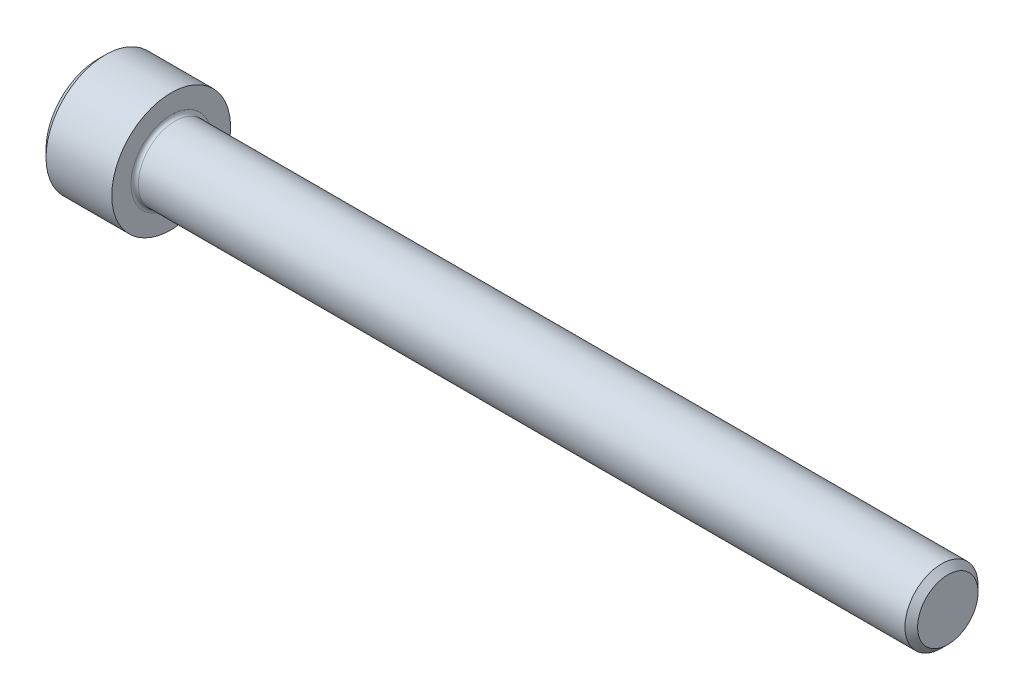
ISO-10303-21;
HEADER;
FILE_DESCRIPTION(('STEP AP214'),'2;1');
FILE_NAME('part.step','',(''),(''),'','','');
FILE_SCHEMA(('AUTOMOTIVE_DESIGN { 1 0 10303 214 1 1 1 1 }'));
ENDSEC;
DATA;
#1=APPLICATION_CONTEXT('core data for automotive mechanical design processes');
#2=APPLICATION_PROTOCOL_DEFINITION('international standard','automotive_design',2000,#1);
#3=PRODUCT_CONTEXT('',#1,'mechanical');
#4=PRODUCT('Part','Part','',(#3));
#5=PRODUCT_RELATED_PRODUCT_CATEGORY('part','',(#4));
#6=PRODUCT_DEFINITION_FORMATION('','',#4);
#7=PRODUCT_DEFINITION_CONTEXT('part definition',#1,'design');
#8=PRODUCT_DEFINITION('design','',#6,#7);
#9=PRODUCT_DEFINITION_SHAPE('','',#8);
#10=(LENGTH_UNIT() NAMED_UNIT(*) SI_UNIT(.MILLI.,.METRE.));
#11=(NAMED_UNIT(*) PLANE_ANGLE_UNIT() SI_UNIT($,.RADIAN.));
#12=(NAMED_UNIT(*) SI_UNIT($,.STERADIAN.) SOLID_ANGLE_UNIT());
#13=UNCERTAINTY_MEASURE_WITH_UNIT(LENGTH_MEASURE(1.E-05),#10,'distance_accuracy_value','');
#14=(GEOMETRIC_REPRESENTATION_CONTEXT(3) GLOBAL_UNCERTAINTY_ASSIGNED_CONTEXT((#13)) GLOBAL_UNIT_ASSIGNED_CONTEXT((#10,
#11,#12)) REPRESENTATION_CONTEXT('',''));
#15=CARTESIAN_POINT('',(0.,0.,0.));
#16=DIRECTION('',(0.,0.,1.));
#17=DIRECTION('',(1.,0.,0.));
#18=AXIS2_PLACEMENT_3D('',#15,#16,#17);
#19=CARTESIAN_POINT('',(0.,0.,0.));
#20=DIRECTION('',(-1.,0.,0.));
#21=DIRECTION('',(0.,0.,1.));
#22=AXIS2_PLACEMENT_3D('',#19,#20,#21);
#23=PLANE('',#22);
#24=DIRECTION('',(0.,-0.5,0.866025403784438));
#25=VECTOR('',#24,1.);
#26=CARTESIAN_POINT('',(0.,3.51894989071077,0.));
#27=LINE('',#26,#25);
#28=CARTESIAN_POINT('',(0.,3.51894989071077,0.));
#29=VERTEX_POINT('',#28);
#30=CARTESIAN_POINT('',(0.,1.75947494535538,3.04749999999999));
#31=VERTEX_POINT('',#30);
#32=EDGE_CURVE('E261',#29,#31,#27,.T.);
#33=ORIENTED_EDGE('',*,*,#32,.T.);
#34=DIRECTION('',(0.,1.,0.));
#35=VECTOR('',#34,1.);
#36=CARTESIAN_POINT('',(0.,-1.75947494535539,3.0475));
#37=LINE('',#36,#35);
#38=CARTESIAN_POINT('',(0.,-1.75947494535539,3.0475));
#39=VERTEX_POINT('',#38);
#40=EDGE_CURVE('E132',#39,#31,#37,.T.);
#41=ORIENTED_EDGE('',*,*,#40,.F.);
#42=DIRECTION('',(0.,-0.500000000000001,-0.866025403784438));
#43=VECTOR('',#42,1.);
#44=CARTESIAN_POINT('',(0.,-1.75947494535539,3.0475));
#45=LINE('',#44,#43);
#46=CARTESIAN_POINT('',(0.,-3.51894989071078,0.));
#47=VERTEX_POINT('',#46);
#48=EDGE_CURVE('E264',#39,#47,#45,.T.);
#49=ORIENTED_EDGE('',*,*,#48,.T.);
#50=DIRECTION('',(0.,0.5,-0.866025403784439));
#51=VECTOR('',#50,1.);
#52=CARTESIAN_POINT('',(0.,-3.51894989071078,0.));
#53=LINE('',#52,#51);
#54=CARTESIAN_POINT('',(0.,-1.75947494535539,-3.0475));
#55=VERTEX_POINT('',#54);
#56=EDGE_CURVE('E267',#47,#55,#53,.T.);
#57=ORIENTED_EDGE('',*,*,#56,.T.);
#58=DIRECTION('',(0.,-1.,0.));
#59=VECTOR('',#58,1.);
#60=CARTESIAN_POINT('',(0.,1.75947494535538,-3.04750000000001));
#61=LINE('',#60,#59);
#62=CARTESIAN_POINT('',(0.,1.75947494535538,-3.04750000000001));
#63=VERTEX_POINT('',#62);
#64=EDGE_CURVE('E270',#63,#55,#61,.T.);
#65=ORIENTED_EDGE('',*,*,#64,.F.);
#66=DIRECTION('',(0.,-0.500000000000001,-0.866025403784438));
#67=VECTOR('',#66,1.);
#68=CARTESIAN_POINT('',(0.,3.51894989071077,0.));
#69=LINE('',#68,#67);
#70=EDGE_CURVE('E127',#29,#63,#69,.T.);
#71=ORIENTED_EDGE('',*,*,#70,.F.);
#72=EDGE_LOOP('',(#33,#41,#49,#57,#65,#71));
#73=FACE_BOUND('',#72,.T.);
#74=CARTESIAN_POINT('',(0.,0.,0.));
#75=DIRECTION('',(-1.,0.,0.));
#76=DIRECTION('',(0.,0.,1.));
#77=AXIS2_PLACEMENT_3D('',#74,#75,#76);
#78=CIRCLE('',#77,5.7);
#79=CARTESIAN_POINT('',(0.,0.,5.7));
#80=VERTEX_POINT('',#79);
#81=EDGE_CURVE('E156',#80,#80,#78,.T.);
#82=ORIENTED_EDGE('',*,*,#81,.T.);
#83=EDGE_LOOP('',(#82));
#84=FACE_BOUND('',#83,.T.);
#85=ADVANCED_FACE('F36',(#73,#84),#23,.T.);
#86=CARTESIAN_POINT('',(0.,0.,0.));
#87=DIRECTION('',(1.,0.,0.));
#88=DIRECTION('',(0.,0.,-1.));
#89=AXIS2_PLACEMENT_3D('',#86,#87,#88);
#90=CONICAL_SURFACE('',#89,5.7,0.785398163397449);
#91=CARTESIAN_POINT('',(0.800000000000002,0.,0.));
#92=DIRECTION('',(-1.,0.,0.));
#93=DIRECTION('',(0.,0.,1.));
#94=AXIS2_PLACEMENT_3D('',#91,#92,#93);
#95=CIRCLE('',#94,6.5);
#96=CARTESIAN_POINT('',(0.800000000000002,0.,6.5));
#97=VERTEX_POINT('',#96);
#98=EDGE_CURVE('E153',#97,#97,#95,.T.);
#99=ORIENTED_EDGE('',*,*,#98,.T.);
#100=EDGE_LOOP('',(#99));
#101=FACE_BOUND('',#100,.T.);
#102=ORIENTED_EDGE('',*,*,#81,.F.);
#103=EDGE_LOOP('',(#102));
#104=FACE_BOUND('',#103,.T.);
#105=ADVANCED_FACE('F177',(#101,#104),#90,.T.);
#106=CARTESIAN_POINT('',(-31.75,0.,0.));
#107=DIRECTION('',(-1.,0.,0.));
#108=DIRECTION('',(0.,0.,1.));
#109=AXIS2_PLACEMENT_3D('',#106,#107,#108);
#110=CYLINDRICAL_SURFACE('',#109,6.5);
#111=CARTESIAN_POINT('',(8.,0.,0.));
#112=DIRECTION('',(-1.,0.,0.));
#113=DIRECTION('',(0.,0.,1.));
#114=AXIS2_PLACEMENT_3D('',#111,#112,#113);
#115=CIRCLE('',#114,6.5);
#116=CARTESIAN_POINT('',(8.,0.,6.5));
#117=VERTEX_POINT('',#116);
#118=EDGE_CURVE('E150',#117,#117,#115,.T.);
#119=ORIENTED_EDGE('',*,*,#118,.T.);
#120=EDGE_LOOP('',(#119));
#121=FACE_BOUND('',#120,.T.);
#122=ORIENTED_EDGE('',*,*,#98,.F.);
#123=EDGE_LOOP('',(#122));
#124=FACE_BOUND('',#123,.T.);
#125=ADVANCED_FACE('F182',(#121,#124),#110,.T.);
#126=CARTESIAN_POINT('',(8.,6.5,0.));
#127=DIRECTION('',(1.,0.,0.));
#128=DIRECTION('',(0.,0.,-1.));
#129=AXIS2_PLACEMENT_3D('',#126,#127,#128);
#130=PLANE('',#129);
#131=CARTESIAN_POINT('',(8.,0.,0.));
#132=DIRECTION('',(1.,0.,0.));
#133=DIRECTION('',(0.,0.,-1.));
#134=AXIS2_PLACEMENT_3D('',#131,#132,#133);
#135=CIRCLE('',#134,4.39999999999986);
#136=CARTESIAN_POINT('',(8.,0.,-4.39999999999986));
#137=VERTEX_POINT('',#136);
#138=EDGE_CURVE('E44',#137,#137,#135,.F.);
#139=ORIENTED_EDGE('',*,*,#138,.T.);
#140=EDGE_LOOP('',(#139));
#141=FACE_BOUND('',#140,.T.);
#142=ORIENTED_EDGE('',*,*,#118,.F.);
#143=EDGE_LOOP('',(#142));
#144=FACE_BOUND('',#143,.T.);
#145=ADVANCED_FACE('F161',(#141,#144),#130,.T.);
#146=CARTESIAN_POINT('',(-31.75,0.,0.));
#147=DIRECTION('',(-1.,0.,0.));
#148=DIRECTION('',(0.,0.,1.));
#149=AXIS2_PLACEMENT_3D('',#146,#147,#148);
#150=CYLINDRICAL_SURFACE('',#149,3.99999999999986);
#151=CARTESIAN_POINT('',(8.4,0.,0.));
#152=DIRECTION('',(1.,0.,0.));
#153=DIRECTION('',(0.,0.,-1.));
#154=AXIS2_PLACEMENT_3D('',#151,#152,#153);
#155=CIRCLE('',#154,3.99999999999986);
#156=CARTESIAN_POINT('',(8.4,0.,-3.99999999999986));
#157=VERTEX_POINT('',#156);
#158=EDGE_CURVE('E11',#157,#157,#155,.T.);
#159=ORIENTED_EDGE('',*,*,#158,.T.);
#160=EDGE_LOOP('',(#159));
#161=FACE_BOUND('',#160,.T.);
#162=CARTESIAN_POINT('',(92.3094999999997,0.,0.));
#163=DIRECTION('',(-1.,0.,0.));
#164=DIRECTION('',(0.,0.,1.));
#165=AXIS2_PLACEMENT_3D('',#162,#163,#164);
#166=CIRCLE('',#165,3.99999999999971);
#167=CARTESIAN_POINT('',(92.3094999999997,0.,3.99999999999971));
#168=VERTEX_POINT('',#167);
#169=EDGE_CURVE('E147',#168,#168,#166,.T.);
#170=ORIENTED_EDGE('',*,*,#169,.T.);
#171=EDGE_LOOP('',(#170));
#172=FACE_BOUND('',#171,.T.);
#173=ADVANCED_FACE('F192',(#161,#172),#150,.T.);
#174=CARTESIAN_POINT('',(93.,0.,0.));
#175=DIRECTION('',(-1.,0.,0.));
#176=DIRECTION('',(0.,0.,1.));
#177=AXIS2_PLACEMENT_3D('',#174,#175,#176);
#178=CONICAL_SURFACE('',#177,3.3095,0.785398163397043);
#179=ORIENTED_EDGE('',*,*,#169,.F.);
#180=EDGE_LOOP('',(#179));
#181=FACE_BOUND('',#180,.T.);
#182=CARTESIAN_POINT('',(93.,0.,0.));
#183=DIRECTION('',(-1.,0.,0.));
#184=DIRECTION('',(0.,0.,1.));
#185=AXIS2_PLACEMENT_3D('',#182,#183,#184);
#186=CIRCLE('',#185,3.3095);
#187=CARTESIAN_POINT('',(93.,0.,3.3095));
#188=VERTEX_POINT('',#187);
#189=EDGE_CURVE('E143',#188,#188,#186,.T.);
#190=ORIENTED_EDGE('',*,*,#189,.T.);
#191=EDGE_LOOP('',(#190));
#192=FACE_BOUND('',#191,.T.);
#193=ADVANCED_FACE('F172',(#181,#192),#178,.T.);
#194=CARTESIAN_POINT('',(93.,3.3095,0.));
#195=DIRECTION('',(1.,0.,0.));
#196=DIRECTION('',(0.,0.,-1.));
#197=AXIS2_PLACEMENT_3D('',#194,#195,#196);
#198=PLANE('',#197);
#199=ORIENTED_EDGE('',*,*,#189,.F.);
#200=EDGE_LOOP('',(#199));
#201=FACE_BOUND('',#200,.T.);
#202=ADVANCED_FACE('F165',(#201),#198,.T.);
#203=CARTESIAN_POINT('',(8.4,0.,0.));
#204=DIRECTION('',(1.,0.,0.));
#205=DIRECTION('',(0.,0.,-1.));
#206=AXIS2_PLACEMENT_3D('',#203,#204,#205);
#207=TOROIDAL_SURFACE('',#206,4.39999999999986,0.4);
#208=ORIENTED_EDGE('',*,*,#158,.F.);
#209=EDGE_LOOP('',(#208));
#210=FACE_BOUND('',#209,.T.);
#211=ORIENTED_EDGE('',*,*,#138,.F.);
#212=EDGE_LOOP('',(#211));
#213=FACE_BOUND('',#212,.T.);
#214=ADVANCED_FACE('F38',(#210,#213),#207,.F.);
#215=CARTESIAN_POINT('',(4.,3.51894989071077,0.));
#216=DIRECTION('',(0.,-0.866025403784438,-0.5));
#217=DIRECTION('',(0.,0.5,-0.866025403784438));
#218=AXIS2_PLACEMENT_3D('',#215,#216,#217);
#219=PLANE('',#218);
#220=ORIENTED_EDGE('',*,*,#32,.F.);
#221=DIRECTION('',(-1.,0.,0.));
#222=VECTOR('',#221,1.);
#223=CARTESIAN_POINT('',(4.,3.51894989071077,0.));
#224=LINE('',#223,#222);
#225=CARTESIAN_POINT('',(4.,3.51894989071077,0.));
#226=VERTEX_POINT('',#225);
#227=EDGE_CURVE('E251',#226,#29,#224,.T.);
#228=ORIENTED_EDGE('',*,*,#227,.F.);
#229=DIRECTION('',(0.,-0.5,0.866025403784438));
#230=VECTOR('',#229,1.);
#231=CARTESIAN_POINT('',(4.,3.51894989071077,0.));
#232=LINE('',#231,#230);
#233=CARTESIAN_POINT('',(4.,2.63921241803307,1.52375));
#234=VERTEX_POINT('',#233);
#235=EDGE_CURVE('E119',#226,#234,#232,.T.);
#236=ORIENTED_EDGE('',*,*,#235,.T.);
#237=CARTESIAN_POINT('',(4.,1.75947494535538,3.04749999999999));
#238=VERTEX_POINT('',#237);
#239=EDGE_CURVE('E110',#234,#238,#232,.T.);
#240=ORIENTED_EDGE('',*,*,#239,.T.);
#241=DIRECTION('',(-1.,0.,0.));
#242=VECTOR('',#241,1.);
#243=CARTESIAN_POINT('',(4.,1.75947494535538,3.04749999999999));
#244=LINE('',#243,#242);
#245=EDGE_CURVE('E124',#238,#31,#244,.T.);
#246=ORIENTED_EDGE('',*,*,#245,.T.);
#247=EDGE_LOOP('',(#220,#228,#236,#240,#246));
#248=FACE_BOUND('',#247,.T.);
#249=ADVANCED_FACE('F123',(#248),#219,.T.);
#250=CARTESIAN_POINT('',(4.,-1.75947494535539,3.0475));
#251=DIRECTION('',(0.,0.,1.));
#252=DIRECTION('',(0.,-1.,0.));
#253=AXIS2_PLACEMENT_3D('',#250,#251,#252);
#254=PLANE('',#253);
#255=ORIENTED_EDGE('',*,*,#40,.T.);
#256=ORIENTED_EDGE('',*,*,#245,.F.);
#257=DIRECTION('',(0.,1.,0.));
#258=VECTOR('',#257,1.);
#259=CARTESIAN_POINT('',(4.,-1.75947494535539,3.0475));
#260=LINE('',#259,#258);
#261=CARTESIAN_POINT('',(4.,0.,3.0475));
#262=VERTEX_POINT('',#261);
#263=EDGE_CURVE('E107',#262,#238,#260,.T.);
#264=ORIENTED_EDGE('',*,*,#263,.F.);
#265=CARTESIAN_POINT('',(4.,-1.75947494535539,3.0475));
#266=VERTEX_POINT('',#265);
#267=EDGE_CURVE('E118',#266,#262,#260,.T.);
#268=ORIENTED_EDGE('',*,*,#267,.F.);
#269=DIRECTION('',(-1.,0.,0.));
#270=VECTOR('',#269,1.);
#271=CARTESIAN_POINT('',(4.,-1.75947494535539,3.0475));
#272=LINE('',#271,#270);
#273=EDGE_CURVE('E134',#266,#39,#272,.T.);
#274=ORIENTED_EDGE('',*,*,#273,.T.);
#275=EDGE_LOOP('',(#255,#256,#264,#268,#274));
#276=FACE_BOUND('',#275,.T.);
#277=ADVANCED_FACE('F129',(#276),#254,.F.);
#278=CARTESIAN_POINT('',(4.,-1.75947494535539,3.0475));
#279=DIRECTION('',(0.,0.866025403784438,-0.500000000000001));
#280=DIRECTION('',(0.,0.500000000000001,0.866025403784438));
#281=AXIS2_PLACEMENT_3D('',#278,#279,#280);
#282=PLANE('',#281);
#283=ORIENTED_EDGE('',*,*,#48,.F.);
#284=ORIENTED_EDGE('',*,*,#273,.F.);
#285=DIRECTION('',(0.,-0.500000000000001,-0.866025403784438));
#286=VECTOR('',#285,1.);
#287=CARTESIAN_POINT('',(4.,-1.75947494535539,3.0475));
#288=LINE('',#287,#286);
#289=CARTESIAN_POINT('',(4.,-2.63921241803308,1.52375000000001));
#290=VERTEX_POINT('',#289);
#291=EDGE_CURVE('E290',#266,#290,#288,.T.);
#292=ORIENTED_EDGE('',*,*,#291,.T.);
#293=CARTESIAN_POINT('',(4.,-3.51894989071078,0.));
#294=VERTEX_POINT('',#293);
#295=EDGE_CURVE('E279',#290,#294,#288,.T.);
#296=ORIENTED_EDGE('',*,*,#295,.T.);
#297=DIRECTION('',(-1.,0.,0.));
#298=VECTOR('',#297,1.);
#299=CARTESIAN_POINT('',(4.,-3.51894989071078,0.));
#300=LINE('',#299,#298);
#301=EDGE_CURVE('E139',#294,#47,#300,.T.);
#302=ORIENTED_EDGE('',*,*,#301,.T.);
#303=EDGE_LOOP('',(#283,#284,#292,#296,#302));
#304=FACE_BOUND('',#303,.T.);
#305=ADVANCED_FACE('F205',(#304),#282,.T.);
#306=CARTESIAN_POINT('',(4.,-3.51894989071078,0.));
#307=DIRECTION('',(0.,0.866025403784439,0.5));
#308=DIRECTION('',(0.,-0.5,0.866025403784439));
#309=AXIS2_PLACEMENT_3D('',#306,#307,#308);
#310=PLANE('',#309);
#311=ORIENTED_EDGE('',*,*,#56,.F.);
#312=ORIENTED_EDGE('',*,*,#301,.F.);
#313=DIRECTION('',(0.,0.5,-0.866025403784439));
#314=VECTOR('',#313,1.);
#315=CARTESIAN_POINT('',(4.,-3.51894989071078,0.));
#316=LINE('',#315,#314);
#317=CARTESIAN_POINT('',(4.,-2.63921241803308,-1.52375));
#318=VERTEX_POINT('',#317);
#319=EDGE_CURVE('E257',#294,#318,#316,.T.);
#320=ORIENTED_EDGE('',*,*,#319,.T.);
#321=CARTESIAN_POINT('',(4.,-1.75947494535539,-3.0475));
#322=VERTEX_POINT('',#321);
#323=EDGE_CURVE('E289',#318,#322,#316,.T.);
#324=ORIENTED_EDGE('',*,*,#323,.T.);
#325=DIRECTION('',(-1.,0.,0.));
#326=VECTOR('',#325,1.);
#327=CARTESIAN_POINT('',(4.,-1.75947494535539,-3.0475));
#328=LINE('',#327,#326);
#329=EDGE_CURVE('E250',#322,#55,#328,.T.);
#330=ORIENTED_EDGE('',*,*,#329,.T.);
#331=EDGE_LOOP('',(#311,#312,#320,#324,#330));
#332=FACE_BOUND('',#331,.T.);
#333=ADVANCED_FACE('F208',(#332),#310,.T.);
#334=CARTESIAN_POINT('',(4.,1.75947494535538,-3.04750000000001));
#335=DIRECTION('',(0.,0.,-1.));
#336=DIRECTION('',(0.,1.,0.));
#337=AXIS2_PLACEMENT_3D('',#334,#335,#336);
#338=PLANE('',#337);
#339=ORIENTED_EDGE('',*,*,#64,.T.);
#340=ORIENTED_EDGE('',*,*,#329,.F.);
#341=DIRECTION('',(0.,-1.,0.));
#342=VECTOR('',#341,1.);
#343=CARTESIAN_POINT('',(4.,1.75947494535538,-3.04750000000001));
#344=LINE('',#343,#342);
#345=CARTESIAN_POINT('',(4.,0.,-3.0475));
#346=VERTEX_POINT('',#345);
#347=EDGE_CURVE('E254',#346,#322,#344,.T.);
#348=ORIENTED_EDGE('',*,*,#347,.F.);
#349=CARTESIAN_POINT('',(4.,1.75947494535538,-3.04750000000001));
#350=VERTEX_POINT('',#349);
#351=EDGE_CURVE('E51',#350,#346,#344,.T.);
#352=ORIENTED_EDGE('',*,*,#351,.F.);
#353=DIRECTION('',(-1.,0.,0.));
#354=VECTOR('',#353,1.);
#355=CARTESIAN_POINT('',(4.,1.75947494535538,-3.04750000000001));
#356=LINE('',#355,#354);
#357=EDGE_CURVE('E247',#350,#63,#356,.T.);
#358=ORIENTED_EDGE('',*,*,#357,.T.);
#359=EDGE_LOOP('',(#339,#340,#348,#352,#358));
#360=FACE_BOUND('',#359,.T.);
#361=ADVANCED_FACE('F212',(#360),#338,.F.);
#362=CARTESIAN_POINT('',(4.,3.51894989071077,0.));
#363=DIRECTION('',(0.,0.866025403784438,-0.500000000000001));
#364=DIRECTION('',(0.,0.500000000000001,0.866025403784438));
#365=AXIS2_PLACEMENT_3D('',#362,#363,#364);
#366=PLANE('',#365);
#367=ORIENTED_EDGE('',*,*,#70,.T.);
#368=ORIENTED_EDGE('',*,*,#357,.F.);
#369=DIRECTION('',(0.,-0.500000000000001,-0.866025403784438));
#370=VECTOR('',#369,1.);
#371=CARTESIAN_POINT('',(4.,3.51894989071077,0.));
#372=LINE('',#371,#370);
#373=CARTESIAN_POINT('',(4.,2.63921241803308,-1.52375));
#374=VERTEX_POINT('',#373);
#375=EDGE_CURVE('E237',#374,#350,#372,.T.);
#376=ORIENTED_EDGE('',*,*,#375,.F.);
#377=EDGE_CURVE('E243',#226,#374,#372,.T.);
#378=ORIENTED_EDGE('',*,*,#377,.F.);
#379=ORIENTED_EDGE('',*,*,#227,.T.);
#380=EDGE_LOOP('',(#367,#368,#376,#378,#379));
#381=FACE_BOUND('',#380,.T.);
#382=ADVANCED_FACE('F216',(#381),#366,.F.);
#383=CARTESIAN_POINT('',(4.,3.51894989071077,0.));
#384=DIRECTION('',(1.,0.,0.));
#385=DIRECTION('',(0.,0.,-1.));
#386=AXIS2_PLACEMENT_3D('',#383,#384,#385);
#387=PLANE('',#386);
#388=ORIENTED_EDGE('',*,*,#347,.T.);
#389=ORIENTED_EDGE('',*,*,#323,.F.);
#390=CARTESIAN_POINT('',(4.,0.,0.));
#391=DIRECTION('',(-1.,0.,0.));
#392=DIRECTION('',(0.,0.,1.));
#393=AXIS2_PLACEMENT_3D('',#390,#391,#392);
#394=CIRCLE('',#393,3.0475);
#395=EDGE_CURVE('E285',#346,#318,#394,.T.);
#396=ORIENTED_EDGE('',*,*,#395,.F.);
#397=EDGE_LOOP('',(#388,#389,#396));
#398=FACE_BOUND('',#397,.T.);
#399=ADVANCED_FACE('F220',(#398),#387,.F.);
#400=ORIENTED_EDGE('',*,*,#319,.F.);
#401=ORIENTED_EDGE('',*,*,#295,.F.);
#402=EDGE_CURVE('E137',#318,#290,#394,.T.);
#403=ORIENTED_EDGE('',*,*,#402,.F.);
#404=EDGE_LOOP('',(#400,#401,#403));
#405=FACE_BOUND('',#404,.T.);
#406=ADVANCED_FACE('F223',(#405),#387,.F.);
#407=ORIENTED_EDGE('',*,*,#291,.F.);
#408=ORIENTED_EDGE('',*,*,#267,.T.);
#409=EDGE_CURVE('E133',#290,#262,#394,.T.);
#410=ORIENTED_EDGE('',*,*,#409,.F.);
#411=EDGE_LOOP('',(#407,#408,#410));
#412=FACE_BOUND('',#411,.T.);
#413=ADVANCED_FACE('F228',(#412),#387,.F.);
#414=ORIENTED_EDGE('',*,*,#263,.T.);
#415=ORIENTED_EDGE('',*,*,#239,.F.);
#416=EDGE_CURVE('E113',#262,#234,#394,.T.);
#417=ORIENTED_EDGE('',*,*,#416,.F.);
#418=EDGE_LOOP('',(#414,#415,#417));
#419=FACE_BOUND('',#418,.T.);
#420=ADVANCED_FACE('F109',(#419),#387,.F.);
#421=ORIENTED_EDGE('',*,*,#235,.F.);
#422=ORIENTED_EDGE('',*,*,#377,.T.);
#423=EDGE_CURVE('E144',#234,#374,#394,.T.);
#424=ORIENTED_EDGE('',*,*,#423,.F.);
#425=EDGE_LOOP('',(#421,#422,#424));
#426=FACE_BOUND('',#425,.T.);
#427=ADVANCED_FACE('F231',(#426),#387,.F.);
#428=ORIENTED_EDGE('',*,*,#375,.T.);
#429=ORIENTED_EDGE('',*,*,#351,.T.);
#430=EDGE_CURVE('E240',#374,#346,#394,.T.);
#431=ORIENTED_EDGE('',*,*,#430,.F.);
#432=EDGE_LOOP('',(#428,#429,#431));
#433=FACE_BOUND('',#432,.T.);
#434=ADVANCED_FACE('F201',(#433),#387,.F.);
#435=CARTESIAN_POINT('',(4.,0.,0.));
#436=DIRECTION('',(-1.,0.,0.));
#437=DIRECTION('',(0.,0.,1.));
#438=AXIS2_PLACEMENT_3D('',#435,#436,#437);
#439=CONICAL_SURFACE('',#438,3.0475,1.04719755119659);
#440=CARTESIAN_POINT('',(5.75947494535541,0.,0.));
#441=VERTEX_POINT('',#440);
#442=VERTEX_LOOP('',#441);
#443=FACE_BOUND('',#442,.T.);
#444=ORIENTED_EDGE('',*,*,#416,.T.);
#445=ORIENTED_EDGE('',*,*,#423,.T.);
#446=ORIENTED_EDGE('',*,*,#430,.T.);
#447=ORIENTED_EDGE('',*,*,#395,.T.);
#448=ORIENTED_EDGE('',*,*,#402,.T.);
#449=ORIENTED_EDGE('',*,*,#409,.T.);
#450=EDGE_LOOP('',(#444,#445,#446,#447,#448,#449));
#451=FACE_BOUND('',#450,.T.);
#452=ADVANCED_FACE('F199',(#443,#451),#439,.F.);
#453=CLOSED_SHELL('',(#85,#105,#125,#145,#173,#193,#202,#214,#249,#277,#305,#333,#361,#382,#399,
#406,#413,#420,#427,#434,#452));
#454=MANIFOLD_SOLID_BREP('B2',#453);
#455=ADVANCED_BREP_SHAPE_REPRESENTATION('',(#18,#454),#14);
#456=SHAPE_DEFINITION_REPRESENTATION(#9,#455);
ENDSEC;
END-ISO-10303-21;
